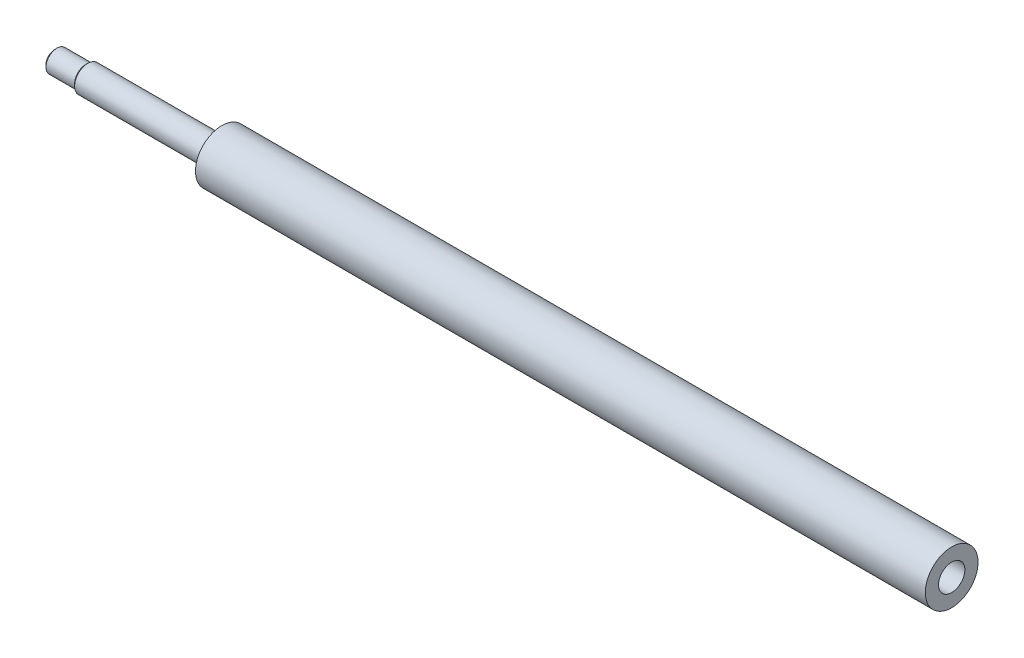
ISO-10303-21;
HEADER;
FILE_DESCRIPTION(('STEP AP214'),'2;1');
FILE_NAME('part.step','',(''),(''),'','','');
FILE_SCHEMA(('AUTOMOTIVE_DESIGN { 1 0 10303 214 1 1 1 1 }'));
ENDSEC;
DATA;
#1=APPLICATION_CONTEXT('core data for automotive mechanical design processes');
#2=APPLICATION_PROTOCOL_DEFINITION('international standard','automotive_design',2000,#1);
#3=PRODUCT_CONTEXT('',#1,'mechanical');
#4=PRODUCT('Part','Part','',(#3));
#5=PRODUCT_RELATED_PRODUCT_CATEGORY('part','',(#4));
#6=PRODUCT_DEFINITION_FORMATION('','',#4);
#7=PRODUCT_DEFINITION_CONTEXT('part definition',#1,'design');
#8=PRODUCT_DEFINITION('design','',#6,#7);
#9=PRODUCT_DEFINITION_SHAPE('','',#8);
#10=(LENGTH_UNIT() NAMED_UNIT(*) SI_UNIT(.MILLI.,.METRE.));
#11=(NAMED_UNIT(*) PLANE_ANGLE_UNIT() SI_UNIT($,.RADIAN.));
#12=(NAMED_UNIT(*) SI_UNIT($,.STERADIAN.) SOLID_ANGLE_UNIT());
#13=UNCERTAINTY_MEASURE_WITH_UNIT(LENGTH_MEASURE(1.E-05),#10,'distance_accuracy_value','');
#14=(GEOMETRIC_REPRESENTATION_CONTEXT(3) GLOBAL_UNCERTAINTY_ASSIGNED_CONTEXT((#13)) GLOBAL_UNIT_ASSIGNED_CONTEXT((#10,
#11,#12)) REPRESENTATION_CONTEXT('',''));
#15=CARTESIAN_POINT('',(0.,0.,0.));
#16=DIRECTION('',(0.,0.,1.));
#17=DIRECTION('',(1.,0.,0.));
#18=AXIS2_PLACEMENT_3D('',#15,#16,#17);
#19=CARTESIAN_POINT('',(-38.,-2.7936044933348,0.44246348416495));
#20=DIRECTION('',(-1.,0.,0.));
#21=DIRECTION('',(0.,0.809016994374949,0.587785252292471));
#22=AXIS2_PLACEMENT_3D('',#19,#20,#21);
#23=PLANE('',#22);
#24=CARTESIAN_POINT('',(-38.,0.,0.));
#25=DIRECTION('',(1.,0.,0.));
#26=DIRECTION('',(0.,0.,-1.));
#27=AXIS2_PLACEMENT_3D('',#24,#25,#26);
#28=CIRCLE('',#27,1.99999999999998);
#29=CARTESIAN_POINT('',(-38.,0.,-1.99999999999998));
#30=VERTEX_POINT('',#29);
#31=EDGE_CURVE('E53',#30,#30,#28,.F.);
#32=ORIENTED_EDGE('',*,*,#31,.T.);
#33=EDGE_LOOP('',(#32));
#34=FACE_BOUND('',#33,.T.);
#35=ADVANCED_FACE('F15',(#34),#23,.T.);
#36=CARTESIAN_POINT('',(148.,-0.66369522624742,-4.1904067400023));
#37=DIRECTION('',(1.,0.,0.));
#38=DIRECTION('',(0.,0.809016994374946,0.587785252292475));
#39=AXIS2_PLACEMENT_3D('',#36,#37,#38);
#40=PLANE('',#39);
#41=CARTESIAN_POINT('',(148.,0.,0.));
#42=DIRECTION('',(-1.,0.,0.));
#43=DIRECTION('',(0.,0.,1.));
#44=AXIS2_PLACEMENT_3D('',#41,#42,#43);
#45=CIRCLE('',#44,2.99999999999995);
#46=CARTESIAN_POINT('',(148.,0.,3.00000000000002));
#47=VERTEX_POINT('',#46);
#48=EDGE_CURVE('E50',#47,#47,#45,.T.);
#49=ORIENTED_EDGE('',*,*,#48,.F.);
#50=EDGE_LOOP('',(#49));
#51=FACE_BOUND('',#50,.T.);
#52=ADVANCED_FACE('F62',(#51),#40,.T.);
#53=CARTESIAN_POINT('',(-37.5,0.,0.));
#54=DIRECTION('',(1.,0.,0.));
#55=DIRECTION('',(0.,0.,-1.));
#56=AXIS2_PLACEMENT_3D('',#53,#54,#55);
#57=CONICAL_SURFACE('',#56,2.50000000000004,0.785398163397506);
#58=CARTESIAN_POINT('',(-37.5,0.,0.));
#59=DIRECTION('',(-1.,0.,0.));
#60=DIRECTION('',(0.,0.809016994374948,0.587785252292472));
#61=AXIS2_PLACEMENT_3D('',#58,#59,#60);
#62=CIRCLE('',#61,2.50000000000004);
#63=CARTESIAN_POINT('',(-37.5,2.0225424859374,1.4694631307312));
#64=VERTEX_POINT('',#63);
#65=EDGE_CURVE('E47',#64,#64,#62,.T.);
#66=ORIENTED_EDGE('',*,*,#65,.T.);
#67=EDGE_LOOP('',(#66));
#68=FACE_BOUND('',#67,.T.);
#69=ORIENTED_EDGE('',*,*,#31,.F.);
#70=EDGE_LOOP('',(#69));
#71=FACE_BOUND('',#70,.T.);
#72=ADVANCED_FACE('F59',(#68,#71),#57,.T.);
#73=CARTESIAN_POINT('',(166.,0.,0.));
#74=DIRECTION('',(-1.,0.,0.));
#75=DIRECTION('',(0.,0.,1.));
#76=AXIS2_PLACEMENT_3D('',#73,#74,#75);
#77=CYLINDRICAL_SURFACE('',#76,2.99999999999995);
#78=ORIENTED_EDGE('',*,*,#48,.T.);
#79=EDGE_LOOP('',(#78));
#80=FACE_BOUND('',#79,.T.);
#81=CARTESIAN_POINT('',(166.,0.,0.));
#82=DIRECTION('',(-1.,0.,0.));
#83=DIRECTION('',(0.,0.,1.));
#84=AXIS2_PLACEMENT_3D('',#81,#82,#83);
#85=CIRCLE('',#84,2.99999999999995);
#86=CARTESIAN_POINT('',(166.,0.,2.99999999999995));
#87=VERTEX_POINT('',#86);
#88=EDGE_CURVE('E44',#87,#87,#85,.T.);
#89=ORIENTED_EDGE('',*,*,#88,.F.);
#90=EDGE_LOOP('',(#89));
#91=FACE_BOUND('',#90,.T.);
#92=ADVANCED_FACE('F61',(#80,#91),#77,.F.);
#93=CARTESIAN_POINT('',(-31.,0.,0.));
#94=DIRECTION('',(-1.,0.,0.));
#95=DIRECTION('',(0.,0.,1.));
#96=AXIS2_PLACEMENT_3D('',#93,#94,#95);
#97=CYLINDRICAL_SURFACE('',#96,2.50000000000004);
#98=CARTESIAN_POINT('',(-31.,0.,0.));
#99=DIRECTION('',(-1.,0.,0.));
#100=DIRECTION('',(0.,0.809016994374948,0.587785252292472));
#101=AXIS2_PLACEMENT_3D('',#98,#99,#100);
#102=CIRCLE('',#101,2.50000000000004);
#103=CARTESIAN_POINT('',(-31.,2.0225424859374,1.4694631307312));
#104=VERTEX_POINT('',#103);
#105=EDGE_CURVE('E41',#104,#104,#102,.T.);
#106=ORIENTED_EDGE('',*,*,#105,.T.);
#107=EDGE_LOOP('',(#106));
#108=FACE_BOUND('',#107,.T.);
#109=ORIENTED_EDGE('',*,*,#65,.F.);
#110=EDGE_LOOP('',(#109));
#111=FACE_BOUND('',#110,.T.);
#112=ADVANCED_FACE('F70',(#108,#111),#97,.T.);
#113=CARTESIAN_POINT('',(166.,-1.3273904524948,-8.3808134800045));
#114=DIRECTION('',(1.,0.,0.));
#115=DIRECTION('',(0.,0.809016994374945,0.587785252292477));
#116=AXIS2_PLACEMENT_3D('',#113,#114,#115);
#117=PLANE('',#116);
#118=ORIENTED_EDGE('',*,*,#88,.T.);
#119=EDGE_LOOP('',(#118));
#120=FACE_BOUND('',#119,.T.);
#121=CARTESIAN_POINT('',(166.,0.,0.));
#122=DIRECTION('',(-1.,0.,0.));
#123=DIRECTION('',(0.,0.,1.));
#124=AXIS2_PLACEMENT_3D('',#121,#122,#123);
#125=CIRCLE('',#124,5.99999999999999);
#126=CARTESIAN_POINT('',(166.,0.,5.99999999999999));
#127=VERTEX_POINT('',#126);
#128=EDGE_CURVE('E38',#127,#127,#125,.F.);
#129=ORIENTED_EDGE('',*,*,#128,.T.);
#130=EDGE_LOOP('',(#129));
#131=FACE_BOUND('',#130,.T.);
#132=ADVANCED_FACE('F94',(#120,#131),#117,.T.);
#133=CARTESIAN_POINT('',(-30.5,0.,0.));
#134=DIRECTION('',(1.,0.,0.));
#135=DIRECTION('',(0.,0.,-1.));
#136=AXIS2_PLACEMENT_3D('',#133,#134,#135);
#137=CONICAL_SURFACE('',#136,2.99999999999995,0.785398163397367);
#138=CARTESIAN_POINT('',(-30.5,0.,0.));
#139=DIRECTION('',(-1.,0.,0.));
#140=DIRECTION('',(0.,0.809016994374946,0.587785252292476));
#141=AXIS2_PLACEMENT_3D('',#138,#139,#140);
#142=CIRCLE('',#141,2.99999999999995);
#143=CARTESIAN_POINT('',(-30.5,2.4270509831248,1.7633557568774));
#144=VERTEX_POINT('',#143);
#145=EDGE_CURVE('E28',#144,#144,#142,.T.);
#146=ORIENTED_EDGE('',*,*,#145,.T.);
#147=EDGE_LOOP('',(#146));
#148=FACE_BOUND('',#147,.T.);
#149=ORIENTED_EDGE('',*,*,#105,.F.);
#150=EDGE_LOOP('',(#149));
#151=FACE_BOUND('',#150,.T.);
#152=ADVANCED_FACE('F88',(#148,#151),#137,.T.);
#153=CARTESIAN_POINT('',(166.,0.,0.));
#154=DIRECTION('',(-1.,0.,0.));
#155=DIRECTION('',(0.,0.,1.));
#156=AXIS2_PLACEMENT_3D('',#153,#154,#155);
#157=CYLINDRICAL_SURFACE('',#156,5.99999999999999);
#158=ORIENTED_EDGE('',*,*,#128,.F.);
#159=EDGE_LOOP('',(#158));
#160=FACE_BOUND('',#159,.T.);
#161=CARTESIAN_POINT('',(0.,-2.25681399217946E-13,3.10623797670223E-13));
#162=DIRECTION('',(-1.,0.,0.));
#163=DIRECTION('',(0.,0.,1.));
#164=AXIS2_PLACEMENT_3D('',#161,#162,#163);
#165=CIRCLE('',#164,5.99999999999999);
#166=CARTESIAN_POINT('',(0.,-2.25681399217946E-13,6.0000000000003));
#167=VERTEX_POINT('',#166);
#168=EDGE_CURVE('E23',#167,#167,#165,.T.);
#169=ORIENTED_EDGE('',*,*,#168,.F.);
#170=EDGE_LOOP('',(#169));
#171=FACE_BOUND('',#170,.T.);
#172=ADVANCED_FACE('F81',(#160,#171),#157,.T.);
#173=CARTESIAN_POINT('',(0.,0.,0.));
#174=DIRECTION('',(-1.,0.,0.));
#175=DIRECTION('',(0.,0.,1.));
#176=AXIS2_PLACEMENT_3D('',#173,#174,#175);
#177=CYLINDRICAL_SURFACE('',#176,2.99999999999995);
#178=CARTESIAN_POINT('',(0.,0.,0.));
#179=DIRECTION('',(-1.,0.,0.));
#180=DIRECTION('',(0.,0.,1.));
#181=AXIS2_PLACEMENT_3D('',#178,#179,#180);
#182=CIRCLE('',#181,2.99999999999995);
#183=CARTESIAN_POINT('',(0.,0.,2.99999999999995));
#184=VERTEX_POINT('',#183);
#185=EDGE_CURVE('E10',#184,#184,#182,.F.);
#186=ORIENTED_EDGE('',*,*,#185,.F.);
#187=EDGE_LOOP('',(#186));
#188=FACE_BOUND('',#187,.T.);
#189=ORIENTED_EDGE('',*,*,#145,.F.);
#190=EDGE_LOOP('',(#189));
#191=FACE_BOUND('',#190,.T.);
#192=ADVANCED_FACE('F77',(#188,#191),#177,.T.);
#193=CARTESIAN_POINT('',(0.,-8.3808134800045,1.3273904524948));
#194=DIRECTION('',(-1.,0.,0.));
#195=DIRECTION('',(0.,0.809016994374945,0.587785252292477));
#196=AXIS2_PLACEMENT_3D('',#193,#194,#195);
#197=PLANE('',#196);
#198=ORIENTED_EDGE('',*,*,#185,.T.);
#199=EDGE_LOOP('',(#198));
#200=FACE_BOUND('',#199,.T.);
#201=ORIENTED_EDGE('',*,*,#168,.T.);
#202=EDGE_LOOP('',(#201));
#203=FACE_BOUND('',#202,.T.);
#204=ADVANCED_FACE('F17',(#200,#203),#197,.T.);
#205=CLOSED_SHELL('',(#35,#52,#72,#92,#112,#132,#152,#172,#192,#204));
#206=MANIFOLD_SOLID_BREP('B1',#205);
#207=ADVANCED_BREP_SHAPE_REPRESENTATION('',(#18,#206),#14);
#208=SHAPE_DEFINITION_REPRESENTATION(#9,#207);
ENDSEC;
END-ISO-10303-21;
